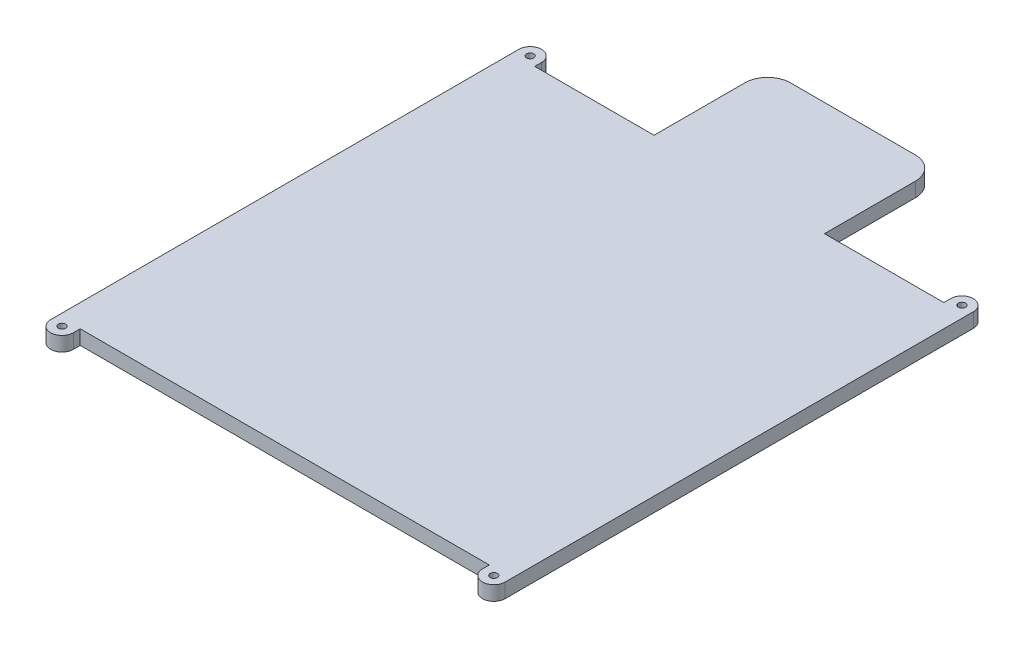
ISO-10303-21;
HEADER;
FILE_DESCRIPTION(('STEP AP214'),'2;1');
FILE_NAME('part.step','',(''),(''),'','','');
FILE_SCHEMA(('AUTOMOTIVE_DESIGN { 1 0 10303 214 1 1 1 1 }'));
ENDSEC;
DATA;
#1=APPLICATION_CONTEXT('core data for automotive mechanical design processes');
#2=APPLICATION_PROTOCOL_DEFINITION('international standard','automotive_design',2000,#1);
#3=PRODUCT_CONTEXT('',#1,'mechanical');
#4=PRODUCT('Part','Part','',(#3));
#5=PRODUCT_RELATED_PRODUCT_CATEGORY('part','',(#4));
#6=PRODUCT_DEFINITION_FORMATION('','',#4);
#7=PRODUCT_DEFINITION_CONTEXT('part definition',#1,'design');
#8=PRODUCT_DEFINITION('design','',#6,#7);
#9=PRODUCT_DEFINITION_SHAPE('','',#8);
#10=(LENGTH_UNIT() NAMED_UNIT(*) SI_UNIT(.MILLI.,.METRE.));
#11=(NAMED_UNIT(*) PLANE_ANGLE_UNIT() SI_UNIT($,.RADIAN.));
#12=(NAMED_UNIT(*) SI_UNIT($,.STERADIAN.) SOLID_ANGLE_UNIT());
#13=UNCERTAINTY_MEASURE_WITH_UNIT(LENGTH_MEASURE(1.E-05),#10,'distance_accuracy_value','');
#14=(GEOMETRIC_REPRESENTATION_CONTEXT(3) GLOBAL_UNCERTAINTY_ASSIGNED_CONTEXT((#13)) GLOBAL_UNIT_ASSIGNED_CONTEXT((#10,
#11,#12)) REPRESENTATION_CONTEXT('',''));
#15=CARTESIAN_POINT('',(0.,0.,0.));
#16=DIRECTION('',(0.,0.,1.));
#17=DIRECTION('',(1.,0.,0.));
#18=AXIS2_PLACEMENT_3D('',#15,#16,#17);
#19=CARTESIAN_POINT('',(-100.,6.35,-100.));
#20=DIRECTION('',(0.,0.,1.));
#21=DIRECTION('',(1.,0.,0.));
#22=AXIS2_PLACEMENT_3D('',#19,#20,#21);
#23=PLANE('',#22);
#24=DIRECTION('',(-1.,0.,0.));
#25=VECTOR('',#24,1.);
#26=CARTESIAN_POINT('',(-100.,6.35,-100.));
#27=LINE('',#26,#25);
#28=CARTESIAN_POINT('',(-37.5,6.35,-100.));
#29=VERTEX_POINT('',#28);
#30=CARTESIAN_POINT('',(-90.,6.35,-100.));
#31=VERTEX_POINT('',#30);
#32=EDGE_CURVE('E183',#29,#31,#27,.T.);
#33=ORIENTED_EDGE('',*,*,#32,.F.);
#34=DIRECTION('',(0.,1.,0.));
#35=VECTOR('',#34,1.);
#36=CARTESIAN_POINT('',(-37.5,-90.1387818865997,-100.));
#37=LINE('',#36,#35);
#38=CARTESIAN_POINT('',(-37.5,0.,-100.));
#39=VERTEX_POINT('',#38);
#40=EDGE_CURVE('E182',#39,#29,#37,.T.);
#41=ORIENTED_EDGE('',*,*,#40,.F.);
#42=DIRECTION('',(-1.,0.,0.));
#43=VECTOR('',#42,1.);
#44=CARTESIAN_POINT('',(-100.,0.,-100.));
#45=LINE('',#44,#43);
#46=CARTESIAN_POINT('',(-90.,0.,-100.));
#47=VERTEX_POINT('',#46);
#48=EDGE_CURVE('E166',#39,#47,#45,.T.);
#49=ORIENTED_EDGE('',*,*,#48,.T.);
#50=DIRECTION('',(0.,1.,0.));
#51=VECTOR('',#50,1.);
#52=CARTESIAN_POINT('',(-90.,-12.8062484748657,-100.));
#53=LINE('',#52,#51);
#54=EDGE_CURVE('E335',#47,#31,#53,.T.);
#55=ORIENTED_EDGE('',*,*,#54,.T.);
#56=EDGE_LOOP('',(#33,#41,#49,#55));
#57=FACE_BOUND('',#56,.T.);
#58=ADVANCED_FACE('F39',(#57),#23,.F.);
#59=CARTESIAN_POINT('',(-100.,6.35,100.));
#60=DIRECTION('',(0.,0.,-1.));
#61=DIRECTION('',(-1.,0.,0.));
#62=AXIS2_PLACEMENT_3D('',#59,#60,#61);
#63=PLANE('',#62);
#64=DIRECTION('',(0.,1.,0.));
#65=VECTOR('',#64,1.);
#66=CARTESIAN_POINT('',(90.0000000000001,-12.8062484748657,100.));
#67=LINE('',#66,#65);
#68=CARTESIAN_POINT('',(90.0000000000001,0.,100.));
#69=VERTEX_POINT('',#68);
#70=CARTESIAN_POINT('',(90.0000000000001,6.35,100.));
#71=VERTEX_POINT('',#70);
#72=EDGE_CURVE('E240',#69,#71,#67,.T.);
#73=ORIENTED_EDGE('',*,*,#72,.T.);
#74=DIRECTION('',(1.,0.,0.));
#75=VECTOR('',#74,1.);
#76=CARTESIAN_POINT('',(-100.,6.35,100.));
#77=LINE('',#76,#75);
#78=CARTESIAN_POINT('',(-90.,6.35,100.));
#79=VERTEX_POINT('',#78);
#80=EDGE_CURVE('E347',#79,#71,#77,.T.);
#81=ORIENTED_EDGE('',*,*,#80,.F.);
#82=DIRECTION('',(0.,1.,0.));
#83=VECTOR('',#82,1.);
#84=CARTESIAN_POINT('',(-90.,-12.8062484748657,100.));
#85=LINE('',#84,#83);
#86=CARTESIAN_POINT('',(-90.,0.,100.));
#87=VERTEX_POINT('',#86);
#88=EDGE_CURVE('E266',#87,#79,#85,.T.);
#89=ORIENTED_EDGE('',*,*,#88,.F.);
#90=DIRECTION('',(1.,0.,0.));
#91=VECTOR('',#90,1.);
#92=CARTESIAN_POINT('',(-100.,0.,100.));
#93=LINE('',#92,#91);
#94=EDGE_CURVE('E361',#87,#69,#93,.T.);
#95=ORIENTED_EDGE('',*,*,#94,.T.);
#96=EDGE_LOOP('',(#73,#81,#89,#95));
#97=FACE_BOUND('',#96,.T.);
#98=ADVANCED_FACE('F429',(#97),#63,.F.);
#99=CARTESIAN_POINT('',(-100.,6.35,-100.));
#100=DIRECTION('',(1.,0.,0.));
#101=DIRECTION('',(0.,0.,-1.));
#102=AXIS2_PLACEMENT_3D('',#99,#100,#101);
#103=PLANE('',#102);
#104=DIRECTION('',(0.,0.,1.));
#105=VECTOR('',#104,1.);
#106=CARTESIAN_POINT('',(-100.,0.,-100.));
#107=LINE('',#106,#105);
#108=CARTESIAN_POINT('',(-100.,0.,-103.));
#109=VERTEX_POINT('',#108);
#110=CARTESIAN_POINT('',(-100.,0.,103.));
#111=VERTEX_POINT('',#110);
#112=EDGE_CURVE('E327',#109,#111,#107,.T.);
#113=ORIENTED_EDGE('',*,*,#112,.T.);
#114=DIRECTION('',(0.,1.,0.));
#115=VECTOR('',#114,1.);
#116=CARTESIAN_POINT('',(-100.,-12.8062484748657,103.));
#117=LINE('',#116,#115);
#118=CARTESIAN_POINT('',(-100.,6.35,103.));
#119=VERTEX_POINT('',#118);
#120=EDGE_CURVE('E265',#111,#119,#117,.T.);
#121=ORIENTED_EDGE('',*,*,#120,.T.);
#122=DIRECTION('',(0.,0.,1.));
#123=VECTOR('',#122,1.);
#124=CARTESIAN_POINT('',(-100.,6.35,-100.));
#125=LINE('',#124,#123);
#126=CARTESIAN_POINT('',(-100.,6.35,-103.));
#127=VERTEX_POINT('',#126);
#128=EDGE_CURVE('E344',#127,#119,#125,.T.);
#129=ORIENTED_EDGE('',*,*,#128,.F.);
#130=DIRECTION('',(0.,1.,0.));
#131=VECTOR('',#130,1.);
#132=CARTESIAN_POINT('',(-100.,-12.8062484748657,-103.));
#133=LINE('',#132,#131);
#134=EDGE_CURVE('E324',#109,#127,#133,.T.);
#135=ORIENTED_EDGE('',*,*,#134,.F.);
#136=EDGE_LOOP('',(#113,#121,#129,#135));
#137=FACE_BOUND('',#136,.T.);
#138=ADVANCED_FACE('F439',(#137),#103,.F.);
#139=CARTESIAN_POINT('',(100.,6.35,-100.));
#140=DIRECTION('',(-1.,0.,0.));
#141=DIRECTION('',(0.,0.,1.));
#142=AXIS2_PLACEMENT_3D('',#139,#140,#141);
#143=PLANE('',#142);
#144=DIRECTION('',(0.,0.,-1.));
#145=VECTOR('',#144,1.);
#146=CARTESIAN_POINT('',(100.,0.,-100.));
#147=LINE('',#146,#145);
#148=CARTESIAN_POINT('',(100.,0.,103.));
#149=VERTEX_POINT('',#148);
#150=CARTESIAN_POINT('',(100.,0.,-103.));
#151=VERTEX_POINT('',#150);
#152=EDGE_CURVE('E178',#149,#151,#147,.T.);
#153=ORIENTED_EDGE('',*,*,#152,.T.);
#154=DIRECTION('',(0.,1.,0.));
#155=VECTOR('',#154,1.);
#156=CARTESIAN_POINT('',(100.,-12.8062484748657,-103.));
#157=LINE('',#156,#155);
#158=CARTESIAN_POINT('',(100.,6.35,-103.));
#159=VERTEX_POINT('',#158);
#160=EDGE_CURVE('E306',#151,#159,#157,.T.);
#161=ORIENTED_EDGE('',*,*,#160,.T.);
#162=DIRECTION('',(0.,0.,-1.));
#163=VECTOR('',#162,1.);
#164=CARTESIAN_POINT('',(100.,6.35,-100.));
#165=LINE('',#164,#163);
#166=CARTESIAN_POINT('',(100.,6.35,103.));
#167=VERTEX_POINT('',#166);
#168=EDGE_CURVE('E351',#167,#159,#165,.T.);
#169=ORIENTED_EDGE('',*,*,#168,.F.);
#170=DIRECTION('',(0.,1.,0.));
#171=VECTOR('',#170,1.);
#172=CARTESIAN_POINT('',(100.,-12.8062484748657,103.));
#173=LINE('',#172,#171);
#174=EDGE_CURVE('E243',#149,#167,#173,.T.);
#175=ORIENTED_EDGE('',*,*,#174,.F.);
#176=EDGE_LOOP('',(#153,#161,#169,#175));
#177=FACE_BOUND('',#176,.T.);
#178=ADVANCED_FACE('F414',(#177),#143,.F.);
#179=CARTESIAN_POINT('',(90.0000000000001,0.,-100.));
#180=VERTEX_POINT('',#179);
#181=CARTESIAN_POINT('',(37.5,0.,-100.));
#182=VERTEX_POINT('',#181);
#183=EDGE_CURVE('E177',#180,#182,#45,.T.);
#184=ORIENTED_EDGE('',*,*,#183,.T.);
#185=DIRECTION('',(0.,1.,0.));
#186=VECTOR('',#185,1.);
#187=CARTESIAN_POINT('',(37.5,-90.1387818865997,-100.));
#188=LINE('',#187,#186);
#189=CARTESIAN_POINT('',(37.5,6.35,-100.));
#190=VERTEX_POINT('',#189);
#191=EDGE_CURVE('E185',#182,#190,#188,.T.);
#192=ORIENTED_EDGE('',*,*,#191,.T.);
#193=CARTESIAN_POINT('',(90.0000000000001,6.35,-100.));
#194=VERTEX_POINT('',#193);
#195=EDGE_CURVE('E354',#194,#190,#27,.T.);
#196=ORIENTED_EDGE('',*,*,#195,.F.);
#197=DIRECTION('',(0.,1.,0.));
#198=VECTOR('',#197,1.);
#199=CARTESIAN_POINT('',(90.0000000000001,-12.8062484748657,-100.));
#200=LINE('',#199,#198);
#201=EDGE_CURVE('E303',#180,#194,#200,.T.);
#202=ORIENTED_EDGE('',*,*,#201,.F.);
#203=EDGE_LOOP('',(#184,#192,#196,#202));
#204=FACE_BOUND('',#203,.T.);
#205=ADVANCED_FACE('F403',(#204),#23,.F.);
#206=CARTESIAN_POINT('',(0.,6.35,0.));
#207=DIRECTION('',(0.,1.,0.));
#208=DIRECTION('',(0.,0.,1.));
#209=AXIS2_PLACEMENT_3D('',#206,#207,#208);
#210=PLANE('',#209);
#211=CARTESIAN_POINT('',(-95.,6.35,103.));
#212=DIRECTION('',(0.,-1.,0.));
#213=DIRECTION('',(0.,0.,-1.));
#214=AXIS2_PLACEMENT_3D('',#211,#212,#213);
#215=CIRCLE('',#214,1.5875);
#216=CARTESIAN_POINT('',(-95.,6.35,101.4125));
#217=VERTEX_POINT('',#216);
#218=EDGE_CURVE('E214',#217,#217,#215,.T.);
#219=ORIENTED_EDGE('',*,*,#218,.T.);
#220=EDGE_LOOP('',(#219));
#221=FACE_BOUND('',#220,.T.);
#222=CARTESIAN_POINT('',(95.0000000000001,6.35,103.));
#223=DIRECTION('',(0.,-1.,0.));
#224=DIRECTION('',(0.,0.,-1.));
#225=AXIS2_PLACEMENT_3D('',#222,#223,#224);
#226=CIRCLE('',#225,1.5875);
#227=CARTESIAN_POINT('',(95.0000000000001,6.35,101.4125));
#228=VERTEX_POINT('',#227);
#229=EDGE_CURVE('E196',#228,#228,#226,.T.);
#230=ORIENTED_EDGE('',*,*,#229,.T.);
#231=EDGE_LOOP('',(#230));
#232=FACE_BOUND('',#231,.T.);
#233=CARTESIAN_POINT('',(95.0000000000001,6.35,-103.));
#234=DIRECTION('',(0.,1.,0.));
#235=DIRECTION('',(0.,0.,1.));
#236=AXIS2_PLACEMENT_3D('',#233,#234,#235);
#237=CIRCLE('',#236,1.5875);
#238=CARTESIAN_POINT('',(95.0000000000001,6.35,-101.4125));
#239=VERTEX_POINT('',#238);
#240=EDGE_CURVE('E256',#239,#239,#237,.T.);
#241=ORIENTED_EDGE('',*,*,#240,.F.);
#242=EDGE_LOOP('',(#241));
#243=FACE_BOUND('',#242,.T.);
#244=CARTESIAN_POINT('',(-95.,6.35,-103.));
#245=DIRECTION('',(0.,1.,0.));
#246=DIRECTION('',(0.,0.,1.));
#247=AXIS2_PLACEMENT_3D('',#244,#245,#246);
#248=CIRCLE('',#247,1.5875);
#249=CARTESIAN_POINT('',(-95.,6.35,-101.4125));
#250=VERTEX_POINT('',#249);
#251=EDGE_CURVE('E295',#250,#250,#248,.T.);
#252=ORIENTED_EDGE('',*,*,#251,.F.);
#253=EDGE_LOOP('',(#252));
#254=FACE_BOUND('',#253,.T.);
#255=DIRECTION('',(-1.,0.,0.));
#256=VECTOR('',#255,1.);
#257=CARTESIAN_POINT('',(-37.5,6.35,-150.));
#258=LINE('',#257,#256);
#259=CARTESIAN_POINT('',(27.5,6.35,-150.));
#260=VERTEX_POINT('',#259);
#261=CARTESIAN_POINT('',(-27.5,6.35,-150.));
#262=VERTEX_POINT('',#261);
#263=EDGE_CURVE('E186',#260,#262,#258,.T.);
#264=ORIENTED_EDGE('',*,*,#263,.T.);
#265=CARTESIAN_POINT('',(-27.5,6.34999999999999,-140.));
#266=DIRECTION('',(0.,1.,0.));
#267=DIRECTION('',(0.,0.,1.));
#268=AXIS2_PLACEMENT_3D('',#265,#266,#267);
#269=CIRCLE('',#268,10.);
#270=CARTESIAN_POINT('',(-37.5,6.35,-140.));
#271=VERTEX_POINT('',#270);
#272=EDGE_CURVE('E377',#262,#271,#269,.T.);
#273=ORIENTED_EDGE('',*,*,#272,.T.);
#274=DIRECTION('',(0.,0.,1.));
#275=VECTOR('',#274,1.);
#276=CARTESIAN_POINT('',(-37.5,6.35,-100.));
#277=LINE('',#276,#275);
#278=EDGE_CURVE('E202',#271,#29,#277,.T.);
#279=ORIENTED_EDGE('',*,*,#278,.T.);
#280=ORIENTED_EDGE('',*,*,#32,.T.);
#281=DIRECTION('',(0.,0.,-1.));
#282=VECTOR('',#281,1.);
#283=CARTESIAN_POINT('',(-90.,6.35,-100.));
#284=LINE('',#283,#282);
#285=CARTESIAN_POINT('',(-90.,6.35,-103.));
#286=VERTEX_POINT('',#285);
#287=EDGE_CURVE('E320',#31,#286,#284,.T.);
#288=ORIENTED_EDGE('',*,*,#287,.T.);
#289=CARTESIAN_POINT('',(-95.,6.35,-103.));
#290=DIRECTION('',(0.,1.,0.));
#291=DIRECTION('',(0.,0.,1.));
#292=AXIS2_PLACEMENT_3D('',#289,#290,#291);
#293=CIRCLE('',#292,5.);
#294=EDGE_CURVE('E331',#286,#127,#293,.T.);
#295=ORIENTED_EDGE('',*,*,#294,.T.);
#296=ORIENTED_EDGE('',*,*,#128,.T.);
#297=CARTESIAN_POINT('',(-95.,6.35,103.));
#298=DIRECTION('',(0.,-1.,0.));
#299=DIRECTION('',(0.,0.,-1.));
#300=AXIS2_PLACEMENT_3D('',#297,#298,#299);
#301=CIRCLE('',#300,5.);
#302=CARTESIAN_POINT('',(-90.,6.35,103.));
#303=VERTEX_POINT('',#302);
#304=EDGE_CURVE('E230',#303,#119,#301,.T.);
#305=ORIENTED_EDGE('',*,*,#304,.F.);
#306=DIRECTION('',(0.,0.,1.));
#307=VECTOR('',#306,1.);
#308=CARTESIAN_POINT('',(-90.,6.35,100.));
#309=LINE('',#308,#307);
#310=EDGE_CURVE('E261',#79,#303,#309,.T.);
#311=ORIENTED_EDGE('',*,*,#310,.F.);
#312=ORIENTED_EDGE('',*,*,#80,.T.);
#313=DIRECTION('',(0.,0.,-1.));
#314=VECTOR('',#313,1.);
#315=CARTESIAN_POINT('',(90.0000000000001,6.35,100.));
#316=LINE('',#315,#314);
#317=CARTESIAN_POINT('',(90.0000000000001,6.35,103.));
#318=VERTEX_POINT('',#317);
#319=EDGE_CURVE('E218',#318,#71,#316,.T.);
#320=ORIENTED_EDGE('',*,*,#319,.F.);
#321=CARTESIAN_POINT('',(95.0000000000001,6.35,103.));
#322=DIRECTION('',(0.,-1.,0.));
#323=DIRECTION('',(0.,0.,-1.));
#324=AXIS2_PLACEMENT_3D('',#321,#322,#323);
#325=CIRCLE('',#324,5.);
#326=EDGE_CURVE('E235',#167,#318,#325,.T.);
#327=ORIENTED_EDGE('',*,*,#326,.F.);
#328=ORIENTED_EDGE('',*,*,#168,.T.);
#329=CARTESIAN_POINT('',(95.0000000000001,6.35,-103.));
#330=DIRECTION('',(0.,1.,0.));
#331=DIRECTION('',(0.,0.,1.));
#332=AXIS2_PLACEMENT_3D('',#329,#330,#331);
#333=CIRCLE('',#332,5.);
#334=CARTESIAN_POINT('',(90.0000000000001,6.35,-103.));
#335=VERTEX_POINT('',#334);
#336=EDGE_CURVE('E299',#159,#335,#333,.T.);
#337=ORIENTED_EDGE('',*,*,#336,.T.);
#338=DIRECTION('',(0.,0.,1.));
#339=VECTOR('',#338,1.);
#340=CARTESIAN_POINT('',(90.0000000000001,6.35,-100.));
#341=LINE('',#340,#339);
#342=EDGE_CURVE('E286',#335,#194,#341,.T.);
#343=ORIENTED_EDGE('',*,*,#342,.T.);
#344=ORIENTED_EDGE('',*,*,#195,.T.);
#345=DIRECTION('',(0.,0.,-1.));
#346=VECTOR('',#345,1.);
#347=CARTESIAN_POINT('',(37.5,6.35,-100.));
#348=LINE('',#347,#346);
#349=CARTESIAN_POINT('',(37.5,6.35,-140.));
#350=VERTEX_POINT('',#349);
#351=EDGE_CURVE('E205',#190,#350,#348,.T.);
#352=ORIENTED_EDGE('',*,*,#351,.T.);
#353=CARTESIAN_POINT('',(27.5,6.34999999999999,-140.));
#354=DIRECTION('',(0.,1.,0.));
#355=DIRECTION('',(0.,0.,1.));
#356=AXIS2_PLACEMENT_3D('',#353,#354,#355);
#357=CIRCLE('',#356,10.);
#358=EDGE_CURVE('E374',#350,#260,#357,.T.);
#359=ORIENTED_EDGE('',*,*,#358,.T.);
#360=EDGE_LOOP('',(#264,#273,#279,#280,#288,#295,#296,#305,#311,#312,#320,#327,#328,#337,#343,
#344,#352,#359));
#361=FACE_BOUND('',#360,.T.);
#362=ADVANCED_FACE('F393',(#221,#232,#243,#254,#361),#210,.T.);
#363=CARTESIAN_POINT('',(0.,0.,0.));
#364=DIRECTION('',(0.,1.,0.));
#365=DIRECTION('',(0.,0.,1.));
#366=AXIS2_PLACEMENT_3D('',#363,#364,#365);
#367=PLANE('',#366);
#368=CARTESIAN_POINT('',(-95.,0.,103.));
#369=DIRECTION('',(0.,1.,0.));
#370=DIRECTION('',(0.,0.,1.));
#371=AXIS2_PLACEMENT_3D('',#368,#369,#370);
#372=CIRCLE('',#371,1.5875);
#373=CARTESIAN_POINT('',(-95.,0.,104.5875));
#374=VERTEX_POINT('',#373);
#375=EDGE_CURVE('E219',#374,#374,#372,.T.);
#376=ORIENTED_EDGE('',*,*,#375,.T.);
#377=EDGE_LOOP('',(#376));
#378=FACE_BOUND('',#377,.T.);
#379=CARTESIAN_POINT('',(95.0000000000001,0.,103.));
#380=DIRECTION('',(0.,1.,0.));
#381=DIRECTION('',(0.,0.,1.));
#382=AXIS2_PLACEMENT_3D('',#379,#380,#381);
#383=CIRCLE('',#382,1.5875);
#384=CARTESIAN_POINT('',(95.0000000000001,0.,104.5875));
#385=VERTEX_POINT('',#384);
#386=EDGE_CURVE('E190',#385,#385,#383,.T.);
#387=ORIENTED_EDGE('',*,*,#386,.T.);
#388=EDGE_LOOP('',(#387));
#389=FACE_BOUND('',#388,.T.);
#390=CARTESIAN_POINT('',(95.0000000000001,0.,-103.));
#391=DIRECTION('',(0.,1.,0.));
#392=DIRECTION('',(0.,0.,1.));
#393=AXIS2_PLACEMENT_3D('',#390,#391,#392);
#394=CIRCLE('',#393,1.5875);
#395=CARTESIAN_POINT('',(95.0000000000001,0.,-101.4125));
#396=VERTEX_POINT('',#395);
#397=EDGE_CURVE('E282',#396,#396,#394,.F.);
#398=ORIENTED_EDGE('',*,*,#397,.F.);
#399=EDGE_LOOP('',(#398));
#400=FACE_BOUND('',#399,.T.);
#401=CARTESIAN_POINT('',(-95.,0.,-103.));
#402=DIRECTION('',(0.,1.,0.));
#403=DIRECTION('',(0.,0.,1.));
#404=AXIS2_PLACEMENT_3D('',#401,#402,#403);
#405=CIRCLE('',#404,1.5875);
#406=CARTESIAN_POINT('',(-95.,0.,-101.4125));
#407=VERTEX_POINT('',#406);
#408=EDGE_CURVE('E316',#407,#407,#405,.F.);
#409=ORIENTED_EDGE('',*,*,#408,.F.);
#410=EDGE_LOOP('',(#409));
#411=FACE_BOUND('',#410,.T.);
#412=DIRECTION('',(0.,0.,-1.));
#413=VECTOR('',#412,1.);
#414=CARTESIAN_POINT('',(-37.5,0.,-100.));
#415=LINE('',#414,#413);
#416=CARTESIAN_POINT('',(-37.5,0.,-140.));
#417=VERTEX_POINT('',#416);
#418=EDGE_CURVE('E169',#39,#417,#415,.T.);
#419=ORIENTED_EDGE('',*,*,#418,.T.);
#420=CARTESIAN_POINT('',(-27.5,0.,-140.));
#421=DIRECTION('',(0.,1.,0.));
#422=DIRECTION('',(0.,0.,1.));
#423=AXIS2_PLACEMENT_3D('',#420,#421,#422);
#424=CIRCLE('',#423,10.);
#425=CARTESIAN_POINT('',(-27.5,0.,-150.));
#426=VERTEX_POINT('',#425);
#427=EDGE_CURVE('E48',#417,#426,#424,.F.);
#428=ORIENTED_EDGE('',*,*,#427,.T.);
#429=DIRECTION('',(1.,0.,0.));
#430=VECTOR('',#429,1.);
#431=CARTESIAN_POINT('',(-37.5,0.,-150.));
#432=LINE('',#431,#430);
#433=CARTESIAN_POINT('',(27.5,0.,-150.));
#434=VERTEX_POINT('',#433);
#435=EDGE_CURVE('E191',#426,#434,#432,.T.);
#436=ORIENTED_EDGE('',*,*,#435,.T.);
#437=CARTESIAN_POINT('',(27.5,0.,-140.));
#438=DIRECTION('',(0.,1.,0.));
#439=DIRECTION('',(0.,0.,1.));
#440=AXIS2_PLACEMENT_3D('',#437,#438,#439);
#441=CIRCLE('',#440,10.);
#442=CARTESIAN_POINT('',(37.5,0.,-140.));
#443=VERTEX_POINT('',#442);
#444=EDGE_CURVE('E55',#434,#443,#441,.F.);
#445=ORIENTED_EDGE('',*,*,#444,.T.);
#446=DIRECTION('',(0.,0.,1.));
#447=VECTOR('',#446,1.);
#448=CARTESIAN_POINT('',(37.5,0.,-100.));
#449=LINE('',#448,#447);
#450=EDGE_CURVE('E198',#443,#182,#449,.T.);
#451=ORIENTED_EDGE('',*,*,#450,.T.);
#452=ORIENTED_EDGE('',*,*,#183,.F.);
#453=DIRECTION('',(0.,0.,-1.));
#454=VECTOR('',#453,1.);
#455=CARTESIAN_POINT('',(90.0000000000001,0.,-100.));
#456=LINE('',#455,#454);
#457=CARTESIAN_POINT('',(90.0000000000001,0.,-103.));
#458=VERTEX_POINT('',#457);
#459=EDGE_CURVE('E291',#180,#458,#456,.T.);
#460=ORIENTED_EDGE('',*,*,#459,.T.);
#461=CARTESIAN_POINT('',(95.0000000000001,0.,-103.));
#462=DIRECTION('',(0.,1.,0.));
#463=DIRECTION('',(0.,0.,1.));
#464=AXIS2_PLACEMENT_3D('',#461,#462,#463);
#465=CIRCLE('',#464,5.);
#466=EDGE_CURVE('E287',#458,#151,#465,.F.);
#467=ORIENTED_EDGE('',*,*,#466,.T.);
#468=ORIENTED_EDGE('',*,*,#152,.F.);
#469=CARTESIAN_POINT('',(95.0000000000001,0.,103.));
#470=DIRECTION('',(0.,1.,0.));
#471=DIRECTION('',(0.,0.,1.));
#472=AXIS2_PLACEMENT_3D('',#469,#470,#471);
#473=CIRCLE('',#472,5.);
#474=CARTESIAN_POINT('',(90.0000000000001,0.,103.));
#475=VERTEX_POINT('',#474);
#476=EDGE_CURVE('E231',#475,#149,#473,.T.);
#477=ORIENTED_EDGE('',*,*,#476,.F.);
#478=DIRECTION('',(0.,0.,1.));
#479=VECTOR('',#478,1.);
#480=CARTESIAN_POINT('',(90.0000000000001,0.,100.));
#481=LINE('',#480,#479);
#482=EDGE_CURVE('E226',#69,#475,#481,.T.);
#483=ORIENTED_EDGE('',*,*,#482,.F.);
#484=ORIENTED_EDGE('',*,*,#94,.F.);
#485=DIRECTION('',(0.,0.,-1.));
#486=VECTOR('',#485,1.);
#487=CARTESIAN_POINT('',(-90.,0.,100.));
#488=LINE('',#487,#486);
#489=CARTESIAN_POINT('',(-90.,0.,103.));
#490=VERTEX_POINT('',#489);
#491=EDGE_CURVE('E252',#490,#87,#488,.T.);
#492=ORIENTED_EDGE('',*,*,#491,.F.);
#493=CARTESIAN_POINT('',(-95.,0.,103.));
#494=DIRECTION('',(0.,1.,0.));
#495=DIRECTION('',(0.,0.,1.));
#496=AXIS2_PLACEMENT_3D('',#493,#494,#495);
#497=CIRCLE('',#496,5.);
#498=EDGE_CURVE('E257',#111,#490,#497,.T.);
#499=ORIENTED_EDGE('',*,*,#498,.F.);
#500=ORIENTED_EDGE('',*,*,#112,.F.);
#501=CARTESIAN_POINT('',(-95.,0.,-103.));
#502=DIRECTION('',(0.,1.,0.));
#503=DIRECTION('',(0.,0.,1.));
#504=AXIS2_PLACEMENT_3D('',#501,#502,#503);
#505=CIRCLE('',#504,5.);
#506=CARTESIAN_POINT('',(-90.,0.,-103.));
#507=VERTEX_POINT('',#506);
#508=EDGE_CURVE('E323',#109,#507,#505,.F.);
#509=ORIENTED_EDGE('',*,*,#508,.T.);
#510=DIRECTION('',(0.,0.,1.));
#511=VECTOR('',#510,1.);
#512=CARTESIAN_POINT('',(-90.,0.,-100.));
#513=LINE('',#512,#511);
#514=EDGE_CURVE('E172',#507,#47,#513,.T.);
#515=ORIENTED_EDGE('',*,*,#514,.T.);
#516=ORIENTED_EDGE('',*,*,#48,.F.);
#517=EDGE_LOOP('',(#419,#428,#436,#445,#451,#452,#460,#467,#468,#477,#483,#484,#492,#499,#500,
#509,#515,#516));
#518=FACE_BOUND('',#517,.T.);
#519=ADVANCED_FACE('F168',(#378,#389,#400,#411,#518),#367,.F.);
#520=CARTESIAN_POINT('',(-95.,-12.8062484748657,-103.));
#521=DIRECTION('',(0.,1.,0.));
#522=DIRECTION('',(0.,0.,1.));
#523=AXIS2_PLACEMENT_3D('',#520,#521,#522);
#524=CYLINDRICAL_SURFACE('',#523,5.);
#525=ORIENTED_EDGE('',*,*,#508,.F.);
#526=ORIENTED_EDGE('',*,*,#134,.T.);
#527=ORIENTED_EDGE('',*,*,#294,.F.);
#528=DIRECTION('',(0.,1.,0.));
#529=VECTOR('',#528,1.);
#530=CARTESIAN_POINT('',(-90.,-12.8062484748657,-103.));
#531=LINE('',#530,#529);
#532=EDGE_CURVE('E339',#507,#286,#531,.T.);
#533=ORIENTED_EDGE('',*,*,#532,.F.);
#534=EDGE_LOOP('',(#525,#526,#527,#533));
#535=FACE_BOUND('',#534,.T.);
#536=ADVANCED_FACE('F443',(#535),#524,.T.);
#537=CARTESIAN_POINT('',(-90.,-12.8062484748657,-100.));
#538=DIRECTION('',(1.,0.,0.));
#539=DIRECTION('',(0.,0.,-1.));
#540=AXIS2_PLACEMENT_3D('',#537,#538,#539);
#541=PLANE('',#540);
#542=ORIENTED_EDGE('',*,*,#514,.F.);
#543=ORIENTED_EDGE('',*,*,#532,.T.);
#544=ORIENTED_EDGE('',*,*,#287,.F.);
#545=ORIENTED_EDGE('',*,*,#54,.F.);
#546=EDGE_LOOP('',(#542,#543,#544,#545));
#547=FACE_BOUND('',#546,.T.);
#548=ADVANCED_FACE('F447',(#547),#541,.T.);
#549=CARTESIAN_POINT('',(-95.,-0.0010000000000036,-103.));
#550=DIRECTION('',(0.,1.,0.));
#551=DIRECTION('',(0.,0.,1.));
#552=AXIS2_PLACEMENT_3D('',#549,#550,#551);
#553=CYLINDRICAL_SURFACE('',#552,1.5875);
#554=ORIENTED_EDGE('',*,*,#251,.T.);
#555=EDGE_LOOP('',(#554));
#556=FACE_BOUND('',#555,.T.);
#557=ORIENTED_EDGE('',*,*,#408,.T.);
#558=EDGE_LOOP('',(#557));
#559=FACE_BOUND('',#558,.T.);
#560=ADVANCED_FACE('F449',(#556,#559),#553,.F.);
#561=CARTESIAN_POINT('',(90.0000000000001,-12.8062484748657,-100.));
#562=DIRECTION('',(-1.,0.,0.));
#563=DIRECTION('',(0.,0.,1.));
#564=AXIS2_PLACEMENT_3D('',#561,#562,#563);
#565=PLANE('',#564);
#566=ORIENTED_EDGE('',*,*,#459,.F.);
#567=ORIENTED_EDGE('',*,*,#201,.T.);
#568=ORIENTED_EDGE('',*,*,#342,.F.);
#569=DIRECTION('',(0.,1.,0.));
#570=VECTOR('',#569,1.);
#571=CARTESIAN_POINT('',(90.0000000000001,-12.8062484748657,-103.));
#572=LINE('',#571,#570);
#573=EDGE_CURVE('E292',#458,#335,#572,.T.);
#574=ORIENTED_EDGE('',*,*,#573,.F.);
#575=EDGE_LOOP('',(#566,#567,#568,#574));
#576=FACE_BOUND('',#575,.T.);
#577=ADVANCED_FACE('F406',(#576),#565,.T.);
#578=CARTESIAN_POINT('',(95.0000000000001,-12.8062484748657,-103.));
#579=DIRECTION('',(0.,1.,0.));
#580=DIRECTION('',(0.,0.,1.));
#581=AXIS2_PLACEMENT_3D('',#578,#579,#580);
#582=CYLINDRICAL_SURFACE('',#581,5.);
#583=ORIENTED_EDGE('',*,*,#466,.F.);
#584=ORIENTED_EDGE('',*,*,#573,.T.);
#585=ORIENTED_EDGE('',*,*,#336,.F.);
#586=ORIENTED_EDGE('',*,*,#160,.F.);
#587=EDGE_LOOP('',(#583,#584,#585,#586));
#588=FACE_BOUND('',#587,.T.);
#589=ADVANCED_FACE('F411',(#588),#582,.T.);
#590=CARTESIAN_POINT('',(95.0000000000001,-0.0010000000000036,-103.));
#591=DIRECTION('',(0.,1.,0.));
#592=DIRECTION('',(0.,0.,1.));
#593=AXIS2_PLACEMENT_3D('',#590,#591,#592);
#594=CYLINDRICAL_SURFACE('',#593,1.5875);
#595=ORIENTED_EDGE('',*,*,#240,.T.);
#596=EDGE_LOOP('',(#595));
#597=FACE_BOUND('',#596,.T.);
#598=ORIENTED_EDGE('',*,*,#397,.T.);
#599=EDGE_LOOP('',(#598));
#600=FACE_BOUND('',#599,.T.);
#601=ADVANCED_FACE('F506',(#597,#600),#594,.F.);
#602=CARTESIAN_POINT('',(-95.,-12.8062484748657,103.));
#603=DIRECTION('',(0.,1.,0.));
#604=DIRECTION('',(0.,0.,1.));
#605=AXIS2_PLACEMENT_3D('',#602,#603,#604);
#606=CYLINDRICAL_SURFACE('',#605,5.);
#607=ORIENTED_EDGE('',*,*,#120,.F.);
#608=ORIENTED_EDGE('',*,*,#498,.T.);
#609=DIRECTION('',(0.,1.,0.));
#610=VECTOR('',#609,1.);
#611=CARTESIAN_POINT('',(-90.,-12.8062484748657,103.));
#612=LINE('',#611,#610);
#613=EDGE_CURVE('E270',#490,#303,#612,.T.);
#614=ORIENTED_EDGE('',*,*,#613,.T.);
#615=ORIENTED_EDGE('',*,*,#304,.T.);
#616=EDGE_LOOP('',(#607,#608,#614,#615));
#617=FACE_BOUND('',#616,.T.);
#618=ADVANCED_FACE('F437',(#617),#606,.T.);
#619=CARTESIAN_POINT('',(-90.,-12.8062484748657,100.));
#620=DIRECTION('',(-1.,0.,0.));
#621=DIRECTION('',(0.,0.,1.));
#622=AXIS2_PLACEMENT_3D('',#619,#620,#621);
#623=PLANE('',#622);
#624=ORIENTED_EDGE('',*,*,#613,.F.);
#625=ORIENTED_EDGE('',*,*,#491,.T.);
#626=ORIENTED_EDGE('',*,*,#88,.T.);
#627=ORIENTED_EDGE('',*,*,#310,.T.);
#628=EDGE_LOOP('',(#624,#625,#626,#627));
#629=FACE_BOUND('',#628,.T.);
#630=ADVANCED_FACE('F432',(#629),#623,.F.);
#631=CARTESIAN_POINT('',(95.0000000000001,-12.8062484748657,103.));
#632=DIRECTION('',(0.,1.,0.));
#633=DIRECTION('',(0.,0.,1.));
#634=AXIS2_PLACEMENT_3D('',#631,#632,#633);
#635=CYLINDRICAL_SURFACE('',#634,5.);
#636=DIRECTION('',(0.,1.,0.));
#637=VECTOR('',#636,1.);
#638=CARTESIAN_POINT('',(90.0000000000001,-12.8062484748657,103.));
#639=LINE('',#638,#637);
#640=EDGE_CURVE('E239',#475,#318,#639,.T.);
#641=ORIENTED_EDGE('',*,*,#640,.F.);
#642=ORIENTED_EDGE('',*,*,#476,.T.);
#643=ORIENTED_EDGE('',*,*,#174,.T.);
#644=ORIENTED_EDGE('',*,*,#326,.T.);
#645=EDGE_LOOP('',(#641,#642,#643,#644));
#646=FACE_BOUND('',#645,.T.);
#647=ADVANCED_FACE('F423',(#646),#635,.T.);
#648=CARTESIAN_POINT('',(90.0000000000001,-12.8062484748657,100.));
#649=DIRECTION('',(1.,0.,0.));
#650=DIRECTION('',(0.,0.,-1.));
#651=AXIS2_PLACEMENT_3D('',#648,#649,#650);
#652=PLANE('',#651);
#653=ORIENTED_EDGE('',*,*,#72,.F.);
#654=ORIENTED_EDGE('',*,*,#482,.T.);
#655=ORIENTED_EDGE('',*,*,#640,.T.);
#656=ORIENTED_EDGE('',*,*,#319,.T.);
#657=EDGE_LOOP('',(#653,#654,#655,#656));
#658=FACE_BOUND('',#657,.T.);
#659=ADVANCED_FACE('F422',(#658),#652,.F.);
#660=CARTESIAN_POINT('',(95.0000000000001,-0.0010000000000036,103.));
#661=DIRECTION('',(0.,1.,0.));
#662=DIRECTION('',(0.,0.,1.));
#663=AXIS2_PLACEMENT_3D('',#660,#661,#662);
#664=CYLINDRICAL_SURFACE('',#663,1.5875);
#665=ORIENTED_EDGE('',*,*,#229,.F.);
#666=EDGE_LOOP('',(#665));
#667=FACE_BOUND('',#666,.T.);
#668=ORIENTED_EDGE('',*,*,#386,.F.);
#669=EDGE_LOOP('',(#668));
#670=FACE_BOUND('',#669,.T.);
#671=ADVANCED_FACE('F493',(#667,#670),#664,.F.);
#672=CARTESIAN_POINT('',(-95.,-0.0010000000000036,103.));
#673=DIRECTION('',(0.,1.,0.));
#674=DIRECTION('',(0.,0.,1.));
#675=AXIS2_PLACEMENT_3D('',#672,#673,#674);
#676=CYLINDRICAL_SURFACE('',#675,1.5875);
#677=ORIENTED_EDGE('',*,*,#218,.F.);
#678=EDGE_LOOP('',(#677));
#679=FACE_BOUND('',#678,.T.);
#680=ORIENTED_EDGE('',*,*,#375,.F.);
#681=EDGE_LOOP('',(#680));
#682=FACE_BOUND('',#681,.T.);
#683=ADVANCED_FACE('F490',(#679,#682),#676,.F.);
#684=CARTESIAN_POINT('',(-37.5,-90.1387818865997,-100.));
#685=DIRECTION('',(-1.,0.,0.));
#686=DIRECTION('',(0.,0.,1.));
#687=AXIS2_PLACEMENT_3D('',#684,#685,#686);
#688=PLANE('',#687);
#689=ORIENTED_EDGE('',*,*,#278,.F.);
#690=DIRECTION('',(0.,1.,0.));
#691=VECTOR('',#690,1.);
#692=CARTESIAN_POINT('',(-37.5,-90.1387818865997,-140.));
#693=LINE('',#692,#691);
#694=EDGE_CURVE('E63',#271,#417,#693,.F.);
#695=ORIENTED_EDGE('',*,*,#694,.T.);
#696=ORIENTED_EDGE('',*,*,#418,.F.);
#697=ORIENTED_EDGE('',*,*,#40,.T.);
#698=EDGE_LOOP('',(#689,#695,#696,#697));
#699=FACE_BOUND('',#698,.T.);
#700=ADVANCED_FACE('F188',(#699),#688,.T.);
#701=CARTESIAN_POINT('',(-37.5,-90.1387818865997,-150.));
#702=DIRECTION('',(0.,0.,-1.));
#703=DIRECTION('',(-1.,0.,0.));
#704=AXIS2_PLACEMENT_3D('',#701,#702,#703);
#705=PLANE('',#704);
#706=ORIENTED_EDGE('',*,*,#435,.F.);
#707=DIRECTION('',(0.,1.,0.));
#708=VECTOR('',#707,1.);
#709=CARTESIAN_POINT('',(-27.5,-90.1387818865997,-150.));
#710=LINE('',#709,#708);
#711=EDGE_CURVE('E370',#426,#262,#710,.T.);
#712=ORIENTED_EDGE('',*,*,#711,.T.);
#713=ORIENTED_EDGE('',*,*,#263,.F.);
#714=DIRECTION('',(0.,1.,0.));
#715=VECTOR('',#714,1.);
#716=CARTESIAN_POINT('',(27.5,-90.1387818865997,-150.));
#717=LINE('',#716,#715);
#718=EDGE_CURVE('E358',#260,#434,#717,.F.);
#719=ORIENTED_EDGE('',*,*,#718,.T.);
#720=EDGE_LOOP('',(#706,#712,#713,#719));
#721=FACE_BOUND('',#720,.T.);
#722=ADVANCED_FACE('F388',(#721),#705,.T.);
#723=CARTESIAN_POINT('',(37.5,-90.1387818865997,-100.));
#724=DIRECTION('',(1.,0.,0.));
#725=DIRECTION('',(0.,0.,-1.));
#726=AXIS2_PLACEMENT_3D('',#723,#724,#725);
#727=PLANE('',#726);
#728=ORIENTED_EDGE('',*,*,#450,.F.);
#729=DIRECTION('',(0.,1.,0.));
#730=VECTOR('',#729,1.);
#731=CARTESIAN_POINT('',(37.5,-90.1387818865997,-140.));
#732=LINE('',#731,#730);
#733=EDGE_CURVE('E11',#443,#350,#732,.T.);
#734=ORIENTED_EDGE('',*,*,#733,.T.);
#735=ORIENTED_EDGE('',*,*,#351,.F.);
#736=ORIENTED_EDGE('',*,*,#191,.F.);
#737=EDGE_LOOP('',(#728,#734,#735,#736));
#738=FACE_BOUND('',#737,.T.);
#739=ADVANCED_FACE('F398',(#738),#727,.T.);
#740=CARTESIAN_POINT('',(-27.5,-90.1387818865997,-140.));
#741=DIRECTION('',(0.,1.,0.));
#742=DIRECTION('',(0.,0.,1.));
#743=AXIS2_PLACEMENT_3D('',#740,#741,#742);
#744=CYLINDRICAL_SURFACE('',#743,10.);
#745=ORIENTED_EDGE('',*,*,#427,.F.);
#746=ORIENTED_EDGE('',*,*,#694,.F.);
#747=ORIENTED_EDGE('',*,*,#272,.F.);
#748=ORIENTED_EDGE('',*,*,#711,.F.);
#749=EDGE_LOOP('',(#745,#746,#747,#748));
#750=FACE_BOUND('',#749,.T.);
#751=ADVANCED_FACE('F391',(#750),#744,.T.);
#752=CARTESIAN_POINT('',(27.5,-90.1387818865997,-140.));
#753=DIRECTION('',(0.,1.,0.));
#754=DIRECTION('',(0.,0.,1.));
#755=AXIS2_PLACEMENT_3D('',#752,#753,#754);
#756=CYLINDRICAL_SURFACE('',#755,10.);
#757=ORIENTED_EDGE('',*,*,#444,.F.);
#758=ORIENTED_EDGE('',*,*,#718,.F.);
#759=ORIENTED_EDGE('',*,*,#358,.F.);
#760=ORIENTED_EDGE('',*,*,#733,.F.);
#761=EDGE_LOOP('',(#757,#758,#759,#760));
#762=FACE_BOUND('',#761,.T.);
#763=ADVANCED_FACE('F41',(#762),#756,.T.);
#764=CLOSED_SHELL('',(#58,#98,#138,#178,#205,#362,#519,#536,#548,#560,#577,#589,#601,#618,#630,
#647,#659,#671,#683,#700,#722,#739,#751,#763));
#765=MANIFOLD_SOLID_BREP('B2',#764);
#766=ADVANCED_BREP_SHAPE_REPRESENTATION('',(#18,#765),#14);
#767=SHAPE_DEFINITION_REPRESENTATION(#9,#766);
ENDSEC;
END-ISO-10303-21;
